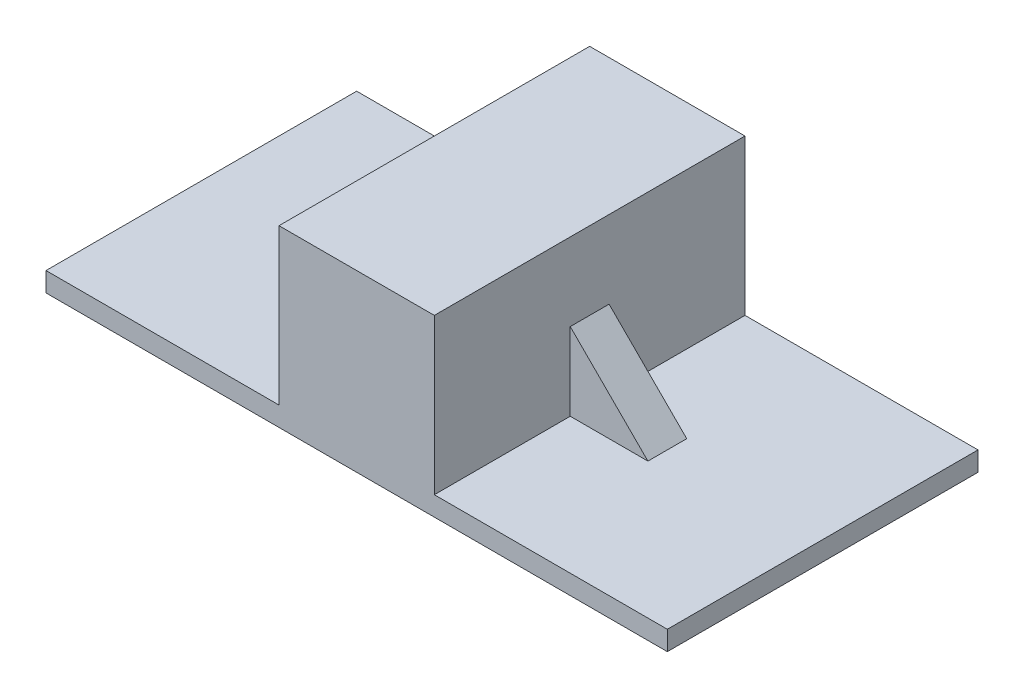
ISO-10303-21;
HEADER;
FILE_DESCRIPTION(('STEP AP214'),'2;1');
FILE_NAME('part.step','',(''),(''),'','','');
FILE_SCHEMA(('AUTOMOTIVE_DESIGN { 1 0 10303 214 1 1 1 1 }'));
ENDSEC;
DATA;
#1=APPLICATION_CONTEXT('core data for automotive mechanical design processes');
#2=APPLICATION_PROTOCOL_DEFINITION('international standard','automotive_design',2000,#1);
#3=PRODUCT_CONTEXT('',#1,'mechanical');
#4=PRODUCT('Part','Part','',(#3));
#5=PRODUCT_RELATED_PRODUCT_CATEGORY('part','',(#4));
#6=PRODUCT_DEFINITION_FORMATION('','',#4);
#7=PRODUCT_DEFINITION_CONTEXT('part definition',#1,'design');
#8=PRODUCT_DEFINITION('design','',#6,#7);
#9=PRODUCT_DEFINITION_SHAPE('','',#8);
#10=(LENGTH_UNIT() NAMED_UNIT(*) SI_UNIT(.MILLI.,.METRE.));
#11=(NAMED_UNIT(*) PLANE_ANGLE_UNIT() SI_UNIT($,.RADIAN.));
#12=(NAMED_UNIT(*) SI_UNIT($,.STERADIAN.) SOLID_ANGLE_UNIT());
#13=UNCERTAINTY_MEASURE_WITH_UNIT(LENGTH_MEASURE(1.E-05),#10,'distance_accuracy_value','');
#14=(GEOMETRIC_REPRESENTATION_CONTEXT(3) GLOBAL_UNCERTAINTY_ASSIGNED_CONTEXT((#13)) GLOBAL_UNIT_ASSIGNED_CONTEXT((#10,
#11,#12)) REPRESENTATION_CONTEXT('',''));
#15=CARTESIAN_POINT('',(0.,0.,0.));
#16=DIRECTION('',(0.,0.,1.));
#17=DIRECTION('',(1.,0.,0.));
#18=AXIS2_PLACEMENT_3D('',#15,#16,#17);
#19=CARTESIAN_POINT('',(0.,6.35,0.));
#20=DIRECTION('',(0.,-1.,0.));
#21=DIRECTION('',(0.,0.,-1.));
#22=AXIS2_PLACEMENT_3D('',#19,#20,#21);
#23=PLANE('',#22);
#24=DIRECTION('',(1.,0.,0.));
#25=VECTOR('',#24,1.);
#26=CARTESIAN_POINT('',(76.2,6.35,-44.45));
#27=LINE('',#26,#25);
#28=CARTESIAN_POINT('',(50.8,6.35,-44.45));
#29=VERTEX_POINT('',#28);
#30=CARTESIAN_POINT('',(76.2,6.35,-44.45));
#31=VERTEX_POINT('',#30);
#32=EDGE_CURVE('E141',#29,#31,#27,.T.);
#33=ORIENTED_EDGE('',*,*,#32,.F.);
#34=DIRECTION('',(0.,0.,-1.));
#35=VECTOR('',#34,1.);
#36=CARTESIAN_POINT('',(50.8,6.35,-44.45));
#37=LINE('',#36,#35);
#38=CARTESIAN_POINT('',(50.8,6.35,-57.15));
#39=VERTEX_POINT('',#38);
#40=EDGE_CURVE('E138',#29,#39,#37,.T.);
#41=ORIENTED_EDGE('',*,*,#40,.T.);
#42=DIRECTION('',(1.,0.,0.));
#43=VECTOR('',#42,1.);
#44=CARTESIAN_POINT('',(76.2,6.35,-57.15));
#45=LINE('',#44,#43);
#46=CARTESIAN_POINT('',(76.2,6.35,-57.15));
#47=VERTEX_POINT('',#46);
#48=EDGE_CURVE('E148',#39,#47,#45,.T.);
#49=ORIENTED_EDGE('',*,*,#48,.T.);
#50=DIRECTION('',(0.,0.,1.));
#51=VECTOR('',#50,1.);
#52=CARTESIAN_POINT('',(76.2,6.35,-101.6));
#53=LINE('',#52,#51);
#54=CARTESIAN_POINT('',(76.2,6.35,-101.6));
#55=VERTEX_POINT('',#54);
#56=EDGE_CURVE('E178',#55,#47,#53,.T.);
#57=ORIENTED_EDGE('',*,*,#56,.F.);
#58=DIRECTION('',(-1.,0.,0.));
#59=VECTOR('',#58,1.);
#60=CARTESIAN_POINT('',(0.,6.35,-101.6));
#61=LINE('',#60,#59);
#62=CARTESIAN_POINT('',(0.,6.35,-101.6));
#63=VERTEX_POINT('',#62);
#64=EDGE_CURVE('E212',#55,#63,#61,.T.);
#65=ORIENTED_EDGE('',*,*,#64,.T.);
#66=DIRECTION('',(0.,0.,1.));
#67=VECTOR('',#66,1.);
#68=CARTESIAN_POINT('',(0.,6.35,0.));
#69=LINE('',#68,#67);
#70=CARTESIAN_POINT('',(0.,6.35,0.));
#71=VERTEX_POINT('',#70);
#72=EDGE_CURVE('E202',#63,#71,#69,.T.);
#73=ORIENTED_EDGE('',*,*,#72,.T.);
#74=DIRECTION('',(1.,0.,0.));
#75=VECTOR('',#74,1.);
#76=CARTESIAN_POINT('',(0.,6.35,0.));
#77=LINE('',#76,#75);
#78=CARTESIAN_POINT('',(76.2,6.35,0.));
#79=VERTEX_POINT('',#78);
#80=EDGE_CURVE('E207',#71,#79,#77,.T.);
#81=ORIENTED_EDGE('',*,*,#80,.T.);
#82=EDGE_CURVE('E190',#31,#79,#53,.T.);
#83=ORIENTED_EDGE('',*,*,#82,.F.);
#84=EDGE_LOOP('',(#33,#41,#49,#57,#65,#73,#81,#83));
#85=FACE_BOUND('',#84,.T.);
#86=ADVANCED_FACE('F33',(#85),#23,.F.);
#87=CARTESIAN_POINT('',(76.2,57.15,-101.6));
#88=DIRECTION('',(1.,0.,0.));
#89=DIRECTION('',(0.,0.,-1.));
#90=AXIS2_PLACEMENT_3D('',#87,#88,#89);
#91=PLANE('',#90);
#92=DIRECTION('',(0.,1.,0.));
#93=VECTOR('',#92,1.);
#94=CARTESIAN_POINT('',(76.2,31.75,-44.45));
#95=LINE('',#94,#93);
#96=CARTESIAN_POINT('',(76.2,31.75,-44.45));
#97=VERTEX_POINT('',#96);
#98=EDGE_CURVE('E142',#31,#97,#95,.T.);
#99=ORIENTED_EDGE('',*,*,#98,.F.);
#100=ORIENTED_EDGE('',*,*,#82,.T.);
#101=DIRECTION('',(0.,-1.,0.));
#102=VECTOR('',#101,1.);
#103=CARTESIAN_POINT('',(76.2,57.15,0.));
#104=LINE('',#103,#102);
#105=CARTESIAN_POINT('',(76.2,57.15,0.));
#106=VERTEX_POINT('',#105);
#107=EDGE_CURVE('E186',#106,#79,#104,.T.);
#108=ORIENTED_EDGE('',*,*,#107,.F.);
#109=DIRECTION('',(0.,0.,1.));
#110=VECTOR('',#109,1.);
#111=CARTESIAN_POINT('',(76.2,57.15,-101.6));
#112=LINE('',#111,#110);
#113=CARTESIAN_POINT('',(76.2,57.15,-101.6));
#114=VERTEX_POINT('',#113);
#115=EDGE_CURVE('E184',#114,#106,#112,.T.);
#116=ORIENTED_EDGE('',*,*,#115,.F.);
#117=DIRECTION('',(0.,-1.,0.));
#118=VECTOR('',#117,1.);
#119=CARTESIAN_POINT('',(76.2,57.15,-101.6));
#120=LINE('',#119,#118);
#121=EDGE_CURVE('E194',#114,#55,#120,.T.);
#122=ORIENTED_EDGE('',*,*,#121,.T.);
#123=ORIENTED_EDGE('',*,*,#56,.T.);
#124=DIRECTION('',(0.,1.,0.));
#125=VECTOR('',#124,1.);
#126=CARTESIAN_POINT('',(76.2,31.75,-57.15));
#127=LINE('',#126,#125);
#128=CARTESIAN_POINT('',(76.2,31.75,-57.15));
#129=VERTEX_POINT('',#128);
#130=EDGE_CURVE('E153',#47,#129,#127,.T.);
#131=ORIENTED_EDGE('',*,*,#130,.T.);
#132=DIRECTION('',(0.,0.,-1.));
#133=VECTOR('',#132,1.);
#134=CARTESIAN_POINT('',(76.2,31.75,-44.45));
#135=LINE('',#134,#133);
#136=EDGE_CURVE('E48',#97,#129,#135,.T.);
#137=ORIENTED_EDGE('',*,*,#136,.F.);
#138=EDGE_LOOP('',(#99,#100,#108,#116,#122,#123,#131,#137));
#139=FACE_BOUND('',#138,.T.);
#140=ADVANCED_FACE('F151',(#139),#91,.F.);
#141=CARTESIAN_POINT('',(0.,6.35,0.));
#142=DIRECTION('',(1.,0.,0.));
#143=DIRECTION('',(0.,0.,-1.));
#144=AXIS2_PLACEMENT_3D('',#141,#142,#143);
#145=PLANE('',#144);
#146=DIRECTION('',(0.,0.,1.));
#147=VECTOR('',#146,1.);
#148=CARTESIAN_POINT('',(0.,0.,0.));
#149=LINE('',#148,#147);
#150=CARTESIAN_POINT('',(0.,0.,-101.6));
#151=VERTEX_POINT('',#150);
#152=CARTESIAN_POINT('',(0.,0.,0.));
#153=VERTEX_POINT('',#152);
#154=EDGE_CURVE('E201',#151,#153,#149,.T.);
#155=ORIENTED_EDGE('',*,*,#154,.T.);
#156=DIRECTION('',(0.,-1.,0.));
#157=VECTOR('',#156,1.);
#158=CARTESIAN_POINT('',(0.,6.35,0.));
#159=LINE('',#158,#157);
#160=EDGE_CURVE('E11',#71,#153,#159,.T.);
#161=ORIENTED_EDGE('',*,*,#160,.F.);
#162=ORIENTED_EDGE('',*,*,#72,.F.);
#163=DIRECTION('',(0.,-1.,0.));
#164=VECTOR('',#163,1.);
#165=CARTESIAN_POINT('',(0.,6.35,-101.6));
#166=LINE('',#165,#164);
#167=EDGE_CURVE('E216',#63,#151,#166,.T.);
#168=ORIENTED_EDGE('',*,*,#167,.T.);
#169=EDGE_LOOP('',(#155,#161,#162,#168));
#170=FACE_BOUND('',#169,.T.);
#171=ADVANCED_FACE('F35',(#170),#145,.F.);
#172=CARTESIAN_POINT('',(0.,6.35,0.));
#173=DIRECTION('',(0.,0.,-1.));
#174=DIRECTION('',(-1.,0.,0.));
#175=AXIS2_PLACEMENT_3D('',#172,#173,#174);
#176=PLANE('',#175);
#177=DIRECTION('',(1.,0.,0.));
#178=VECTOR('',#177,1.);
#179=CARTESIAN_POINT('',(0.,0.,0.));
#180=LINE('',#179,#178);
#181=CARTESIAN_POINT('',(203.2,0.,0.));
#182=VERTEX_POINT('',#181);
#183=EDGE_CURVE('E219',#153,#182,#180,.T.);
#184=ORIENTED_EDGE('',*,*,#183,.T.);
#185=DIRECTION('',(0.,-1.,0.));
#186=VECTOR('',#185,1.);
#187=CARTESIAN_POINT('',(203.2,6.35,0.));
#188=LINE('',#187,#186);
#189=CARTESIAN_POINT('',(203.2,6.35,0.));
#190=VERTEX_POINT('',#189);
#191=EDGE_CURVE('E41',#190,#182,#188,.T.);
#192=ORIENTED_EDGE('',*,*,#191,.F.);
#193=CARTESIAN_POINT('',(127.,6.35,0.));
#194=VERTEX_POINT('',#193);
#195=EDGE_CURVE('E205',#194,#190,#77,.T.);
#196=ORIENTED_EDGE('',*,*,#195,.F.);
#197=DIRECTION('',(0.,-1.,0.));
#198=VECTOR('',#197,1.);
#199=CARTESIAN_POINT('',(127.,57.15,0.));
#200=LINE('',#199,#198);
#201=CARTESIAN_POINT('',(127.,57.15,0.));
#202=VERTEX_POINT('',#201);
#203=EDGE_CURVE('E198',#202,#194,#200,.T.);
#204=ORIENTED_EDGE('',*,*,#203,.F.);
#205=DIRECTION('',(1.,0.,0.));
#206=VECTOR('',#205,1.);
#207=CARTESIAN_POINT('',(76.2,57.15,0.));
#208=LINE('',#207,#206);
#209=EDGE_CURVE('E175',#106,#202,#208,.T.);
#210=ORIENTED_EDGE('',*,*,#209,.F.);
#211=ORIENTED_EDGE('',*,*,#107,.T.);
#212=ORIENTED_EDGE('',*,*,#80,.F.);
#213=ORIENTED_EDGE('',*,*,#160,.T.);
#214=EDGE_LOOP('',(#184,#192,#196,#204,#210,#211,#212,#213));
#215=FACE_BOUND('',#214,.T.);
#216=ADVANCED_FACE('F269',(#215),#176,.F.);
#217=CARTESIAN_POINT('',(203.2,6.35,0.));
#218=DIRECTION('',(-1.,0.,0.));
#219=DIRECTION('',(0.,0.,1.));
#220=AXIS2_PLACEMENT_3D('',#217,#218,#219);
#221=PLANE('',#220);
#222=DIRECTION('',(0.,0.,-1.));
#223=VECTOR('',#222,1.);
#224=CARTESIAN_POINT('',(203.2,0.,0.));
#225=LINE('',#224,#223);
#226=CARTESIAN_POINT('',(203.2,0.,-101.6));
#227=VERTEX_POINT('',#226);
#228=EDGE_CURVE('E221',#182,#227,#225,.T.);
#229=ORIENTED_EDGE('',*,*,#228,.T.);
#230=DIRECTION('',(0.,-1.,0.));
#231=VECTOR('',#230,1.);
#232=CARTESIAN_POINT('',(203.2,6.35,-101.6));
#233=LINE('',#232,#231);
#234=CARTESIAN_POINT('',(203.2,6.35,-101.6));
#235=VERTEX_POINT('',#234);
#236=EDGE_CURVE('E226',#235,#227,#233,.T.);
#237=ORIENTED_EDGE('',*,*,#236,.F.);
#238=DIRECTION('',(0.,0.,-1.));
#239=VECTOR('',#238,1.);
#240=CARTESIAN_POINT('',(203.2,6.35,0.));
#241=LINE('',#240,#239);
#242=EDGE_CURVE('E210',#190,#235,#241,.T.);
#243=ORIENTED_EDGE('',*,*,#242,.F.);
#244=ORIENTED_EDGE('',*,*,#191,.T.);
#245=EDGE_LOOP('',(#229,#237,#243,#244));
#246=FACE_BOUND('',#245,.T.);
#247=ADVANCED_FACE('F233',(#246),#221,.F.);
#248=CARTESIAN_POINT('',(0.,6.35,-101.6));
#249=DIRECTION('',(0.,0.,1.));
#250=DIRECTION('',(1.,0.,0.));
#251=AXIS2_PLACEMENT_3D('',#248,#249,#250);
#252=PLANE('',#251);
#253=DIRECTION('',(-1.,0.,0.));
#254=VECTOR('',#253,1.);
#255=CARTESIAN_POINT('',(0.,0.,-101.6));
#256=LINE('',#255,#254);
#257=EDGE_CURVE('E206',#227,#151,#256,.T.);
#258=ORIENTED_EDGE('',*,*,#257,.T.);
#259=ORIENTED_EDGE('',*,*,#167,.F.);
#260=ORIENTED_EDGE('',*,*,#64,.F.);
#261=ORIENTED_EDGE('',*,*,#121,.F.);
#262=DIRECTION('',(1.,0.,0.));
#263=VECTOR('',#262,1.);
#264=CARTESIAN_POINT('',(76.2,57.15,-101.6));
#265=LINE('',#264,#263);
#266=CARTESIAN_POINT('',(127.,57.15,-101.6));
#267=VERTEX_POINT('',#266);
#268=EDGE_CURVE('E181',#114,#267,#265,.T.);
#269=ORIENTED_EDGE('',*,*,#268,.T.);
#270=DIRECTION('',(0.,-1.,0.));
#271=VECTOR('',#270,1.);
#272=CARTESIAN_POINT('',(127.,57.15,-101.6));
#273=LINE('',#272,#271);
#274=CARTESIAN_POINT('',(127.,6.35,-101.6));
#275=VERTEX_POINT('',#274);
#276=EDGE_CURVE('E196',#267,#275,#273,.T.);
#277=ORIENTED_EDGE('',*,*,#276,.T.);
#278=EDGE_CURVE('E213',#235,#275,#61,.T.);
#279=ORIENTED_EDGE('',*,*,#278,.F.);
#280=ORIENTED_EDGE('',*,*,#236,.T.);
#281=EDGE_LOOP('',(#258,#259,#260,#261,#269,#277,#279,#280));
#282=FACE_BOUND('',#281,.T.);
#283=ADVANCED_FACE('F243',(#282),#252,.F.);
#284=DIRECTION('',(0.,0.,-1.));
#285=VECTOR('',#284,1.);
#286=CARTESIAN_POINT('',(152.4,6.35,-44.45));
#287=LINE('',#286,#285);
#288=CARTESIAN_POINT('',(152.4,6.35,-44.45));
#289=VERTEX_POINT('',#288);
#290=CARTESIAN_POINT('',(152.4,6.35,-57.15));
#291=VERTEX_POINT('',#290);
#292=EDGE_CURVE('E172',#289,#291,#287,.T.);
#293=ORIENTED_EDGE('',*,*,#292,.F.);
#294=DIRECTION('',(1.,0.,0.));
#295=VECTOR('',#294,1.);
#296=CARTESIAN_POINT('',(127.,6.35,-44.45));
#297=LINE('',#296,#295);
#298=CARTESIAN_POINT('',(127.,6.35,-44.45));
#299=VERTEX_POINT('',#298);
#300=EDGE_CURVE('E162',#299,#289,#297,.T.);
#301=ORIENTED_EDGE('',*,*,#300,.F.);
#302=DIRECTION('',(0.,0.,1.));
#303=VECTOR('',#302,1.);
#304=CARTESIAN_POINT('',(127.,6.35,-101.6));
#305=LINE('',#304,#303);
#306=EDGE_CURVE('E174',#299,#194,#305,.T.);
#307=ORIENTED_EDGE('',*,*,#306,.T.);
#308=ORIENTED_EDGE('',*,*,#195,.T.);
#309=ORIENTED_EDGE('',*,*,#242,.T.);
#310=ORIENTED_EDGE('',*,*,#278,.T.);
#311=CARTESIAN_POINT('',(127.,6.35,-57.15));
#312=VERTEX_POINT('',#311);
#313=EDGE_CURVE('E187',#275,#312,#305,.T.);
#314=ORIENTED_EDGE('',*,*,#313,.T.);
#315=DIRECTION('',(1.,0.,0.));
#316=VECTOR('',#315,1.);
#317=CARTESIAN_POINT('',(127.,6.35,-57.15));
#318=LINE('',#317,#316);
#319=EDGE_CURVE('E56',#312,#291,#318,.T.);
#320=ORIENTED_EDGE('',*,*,#319,.T.);
#321=EDGE_LOOP('',(#293,#301,#307,#308,#309,#310,#314,#320));
#322=FACE_BOUND('',#321,.T.);
#323=ADVANCED_FACE('F267',(#322),#23,.F.);
#324=CARTESIAN_POINT('',(0.,0.,0.));
#325=DIRECTION('',(0.,-1.,0.));
#326=DIRECTION('',(0.,0.,-1.));
#327=AXIS2_PLACEMENT_3D('',#324,#325,#326);
#328=PLANE('',#327);
#329=ORIENTED_EDGE('',*,*,#154,.F.);
#330=ORIENTED_EDGE('',*,*,#257,.F.);
#331=ORIENTED_EDGE('',*,*,#228,.F.);
#332=ORIENTED_EDGE('',*,*,#183,.F.);
#333=EDGE_LOOP('',(#329,#330,#331,#332));
#334=FACE_BOUND('',#333,.T.);
#335=ADVANCED_FACE('F240',(#334),#328,.T.);
#336=CARTESIAN_POINT('',(127.,57.15,-101.6));
#337=DIRECTION('',(1.,0.,0.));
#338=DIRECTION('',(0.,0.,-1.));
#339=AXIS2_PLACEMENT_3D('',#336,#337,#338);
#340=PLANE('',#339);
#341=DIRECTION('',(0.,-1.,0.));
#342=VECTOR('',#341,1.);
#343=CARTESIAN_POINT('',(127.,31.75,-44.45));
#344=LINE('',#343,#342);
#345=CARTESIAN_POINT('',(127.,31.75,-44.45));
#346=VERTEX_POINT('',#345);
#347=EDGE_CURVE('E160',#346,#299,#344,.T.);
#348=ORIENTED_EDGE('',*,*,#347,.F.);
#349=DIRECTION('',(0.,0.,-1.));
#350=VECTOR('',#349,1.);
#351=CARTESIAN_POINT('',(127.,31.75,-44.45));
#352=LINE('',#351,#350);
#353=CARTESIAN_POINT('',(127.,31.75,-57.15));
#354=VERTEX_POINT('',#353);
#355=EDGE_CURVE('E166',#346,#354,#352,.T.);
#356=ORIENTED_EDGE('',*,*,#355,.T.);
#357=DIRECTION('',(0.,-1.,0.));
#358=VECTOR('',#357,1.);
#359=CARTESIAN_POINT('',(127.,31.75,-57.15));
#360=LINE('',#359,#358);
#361=EDGE_CURVE('E154',#354,#312,#360,.T.);
#362=ORIENTED_EDGE('',*,*,#361,.T.);
#363=ORIENTED_EDGE('',*,*,#313,.F.);
#364=ORIENTED_EDGE('',*,*,#276,.F.);
#365=DIRECTION('',(0.,0.,1.));
#366=VECTOR('',#365,1.);
#367=CARTESIAN_POINT('',(127.,57.15,-101.6));
#368=LINE('',#367,#366);
#369=EDGE_CURVE('E177',#267,#202,#368,.T.);
#370=ORIENTED_EDGE('',*,*,#369,.T.);
#371=ORIENTED_EDGE('',*,*,#203,.T.);
#372=ORIENTED_EDGE('',*,*,#306,.F.);
#373=EDGE_LOOP('',(#348,#356,#362,#363,#364,#370,#371,#372));
#374=FACE_BOUND('',#373,.T.);
#375=ADVANCED_FACE('F262',(#374),#340,.T.);
#376=CARTESIAN_POINT('',(0.,57.15,0.));
#377=DIRECTION('',(0.,-1.,0.));
#378=DIRECTION('',(0.,0.,-1.));
#379=AXIS2_PLACEMENT_3D('',#376,#377,#378);
#380=PLANE('',#379);
#381=ORIENTED_EDGE('',*,*,#209,.T.);
#382=ORIENTED_EDGE('',*,*,#369,.F.);
#383=ORIENTED_EDGE('',*,*,#268,.F.);
#384=ORIENTED_EDGE('',*,*,#115,.T.);
#385=EDGE_LOOP('',(#381,#382,#383,#384));
#386=FACE_BOUND('',#385,.T.);
#387=ADVANCED_FACE('F258',(#386),#380,.F.);
#388=CARTESIAN_POINT('',(127.,31.75,-44.45));
#389=DIRECTION('',(-0.707106781186547,-0.707106781186548,0.));
#390=DIRECTION('',(0.707106781186548,-0.707106781186547,0.));
#391=AXIS2_PLACEMENT_3D('',#388,#389,#390);
#392=PLANE('',#391);
#393=DIRECTION('',(-0.707106781186548,0.707106781186547,0.));
#394=VECTOR('',#393,1.);
#395=CARTESIAN_POINT('',(127.,31.75,-57.15));
#396=LINE('',#395,#394);
#397=EDGE_CURVE('E163',#291,#354,#396,.T.);
#398=ORIENTED_EDGE('',*,*,#397,.T.);
#399=ORIENTED_EDGE('',*,*,#355,.F.);
#400=DIRECTION('',(-0.707106781186548,0.707106781186547,0.));
#401=VECTOR('',#400,1.);
#402=CARTESIAN_POINT('',(127.,31.75,-44.45));
#403=LINE('',#402,#401);
#404=EDGE_CURVE('E165',#289,#346,#403,.T.);
#405=ORIENTED_EDGE('',*,*,#404,.F.);
#406=ORIENTED_EDGE('',*,*,#292,.T.);
#407=EDGE_LOOP('',(#398,#399,#405,#406));
#408=FACE_BOUND('',#407,.T.);
#409=ADVANCED_FACE('F335',(#408),#392,.F.);
#410=CARTESIAN_POINT('',(0.,0.,-44.45));
#411=DIRECTION('',(0.,0.,1.));
#412=DIRECTION('',(1.,0.,0.));
#413=AXIS2_PLACEMENT_3D('',#410,#411,#412);
#414=PLANE('',#413);
#415=ORIENTED_EDGE('',*,*,#347,.T.);
#416=ORIENTED_EDGE('',*,*,#300,.T.);
#417=ORIENTED_EDGE('',*,*,#404,.T.);
#418=EDGE_LOOP('',(#415,#416,#417));
#419=FACE_BOUND('',#418,.T.);
#420=ADVANCED_FACE('F351',(#419),#414,.T.);
#421=CARTESIAN_POINT('',(0.,0.,-57.15));
#422=DIRECTION('',(0.,0.,1.));
#423=DIRECTION('',(1.,0.,0.));
#424=AXIS2_PLACEMENT_3D('',#421,#422,#423);
#425=PLANE('',#424);
#426=ORIENTED_EDGE('',*,*,#361,.F.);
#427=ORIENTED_EDGE('',*,*,#397,.F.);
#428=ORIENTED_EDGE('',*,*,#319,.F.);
#429=EDGE_LOOP('',(#426,#427,#428));
#430=FACE_BOUND('',#429,.T.);
#431=ADVANCED_FACE('F360',(#430),#425,.F.);
#432=CARTESIAN_POINT('',(76.2,31.75,-44.45));
#433=DIRECTION('',(0.707106781186548,-0.707106781186548,0.));
#434=DIRECTION('',(0.707106781186548,0.707106781186548,0.));
#435=AXIS2_PLACEMENT_3D('',#432,#433,#434);
#436=PLANE('',#435);
#437=DIRECTION('',(-0.707106781186547,-0.707106781186547,0.));
#438=VECTOR('',#437,1.);
#439=CARTESIAN_POINT('',(76.2,31.75,-57.15));
#440=LINE('',#439,#438);
#441=EDGE_CURVE('E402',#129,#39,#440,.T.);
#442=ORIENTED_EDGE('',*,*,#441,.T.);
#443=ORIENTED_EDGE('',*,*,#40,.F.);
#444=DIRECTION('',(-0.707106781186547,-0.707106781186547,0.));
#445=VECTOR('',#444,1.);
#446=CARTESIAN_POINT('',(76.2,31.75,-44.45));
#447=LINE('',#446,#445);
#448=EDGE_CURVE('E134',#97,#29,#447,.T.);
#449=ORIENTED_EDGE('',*,*,#448,.F.);
#450=ORIENTED_EDGE('',*,*,#136,.T.);
#451=EDGE_LOOP('',(#442,#443,#449,#450));
#452=FACE_BOUND('',#451,.T.);
#453=ADVANCED_FACE('F136',(#452),#436,.F.);
#454=CARTESIAN_POINT('',(0.,0.,-44.45));
#455=DIRECTION('',(0.,0.,-1.));
#456=DIRECTION('',(-1.,0.,0.));
#457=AXIS2_PLACEMENT_3D('',#454,#455,#456);
#458=PLANE('',#457);
#459=ORIENTED_EDGE('',*,*,#98,.T.);
#460=ORIENTED_EDGE('',*,*,#448,.T.);
#461=ORIENTED_EDGE('',*,*,#32,.T.);
#462=EDGE_LOOP('',(#459,#460,#461));
#463=FACE_BOUND('',#462,.T.);
#464=ADVANCED_FACE('F145',(#463),#458,.F.);
#465=CARTESIAN_POINT('',(0.,0.,-57.15));
#466=DIRECTION('',(0.,0.,-1.));
#467=DIRECTION('',(-1.,0.,0.));
#468=AXIS2_PLACEMENT_3D('',#465,#466,#467);
#469=PLANE('',#468);
#470=ORIENTED_EDGE('',*,*,#130,.F.);
#471=ORIENTED_EDGE('',*,*,#48,.F.);
#472=ORIENTED_EDGE('',*,*,#441,.F.);
#473=EDGE_LOOP('',(#470,#471,#472));
#474=FACE_BOUND('',#473,.T.);
#475=ADVANCED_FACE('F383',(#474),#469,.T.);
#476=CLOSED_SHELL('',(#86,#140,#171,#216,#247,#283,#323,#335,#375,#387,#409,#420,#431,#453,#464,#475));
#477=MANIFOLD_SOLID_BREP('B2',#476);
#478=ADVANCED_BREP_SHAPE_REPRESENTATION('',(#18,#477),#14);
#479=SHAPE_DEFINITION_REPRESENTATION(#9,#478);
ENDSEC;
END-ISO-10303-21;
